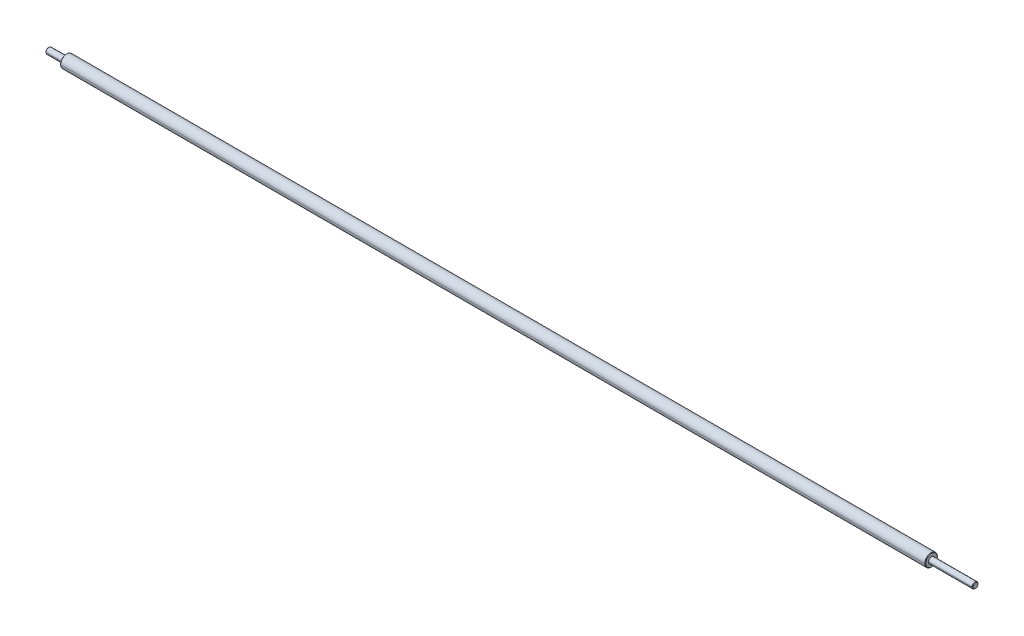
ISO-10303-21;
HEADER;
FILE_DESCRIPTION(('STEP AP214'),'2;1');
FILE_NAME('part.step','',(''),(''),'','','');
FILE_SCHEMA(('AUTOMOTIVE_DESIGN { 1 0 10303 214 1 1 1 1 }'));
ENDSEC;
DATA;
#1=APPLICATION_CONTEXT('core data for automotive mechanical design processes');
#2=APPLICATION_PROTOCOL_DEFINITION('international standard','automotive_design',2000,#1);
#3=PRODUCT_CONTEXT('',#1,'mechanical');
#4=PRODUCT('Part','Part','',(#3));
#5=PRODUCT_RELATED_PRODUCT_CATEGORY('part','',(#4));
#6=PRODUCT_DEFINITION_FORMATION('','',#4);
#7=PRODUCT_DEFINITION_CONTEXT('part definition',#1,'design');
#8=PRODUCT_DEFINITION('design','',#6,#7);
#9=PRODUCT_DEFINITION_SHAPE('','',#8);
#10=(LENGTH_UNIT() NAMED_UNIT(*) SI_UNIT(.MILLI.,.METRE.));
#11=(NAMED_UNIT(*) PLANE_ANGLE_UNIT() SI_UNIT($,.RADIAN.));
#12=(NAMED_UNIT(*) SI_UNIT($,.STERADIAN.) SOLID_ANGLE_UNIT());
#13=UNCERTAINTY_MEASURE_WITH_UNIT(LENGTH_MEASURE(1.E-05),#10,'distance_accuracy_value','');
#14=(GEOMETRIC_REPRESENTATION_CONTEXT(3) GLOBAL_UNCERTAINTY_ASSIGNED_CONTEXT((#13)) GLOBAL_UNIT_ASSIGNED_CONTEXT((#10,
#11,#12)) REPRESENTATION_CONTEXT('',''));
#15=CARTESIAN_POINT('',(0.,0.,0.));
#16=DIRECTION('',(0.,0.,1.));
#17=DIRECTION('',(1.,0.,0.));
#18=AXIS2_PLACEMENT_3D('',#15,#16,#17);
#19=CARTESIAN_POINT('',(-715.9625,0.,0.));
#20=DIRECTION('',(1.,0.,0.));
#21=DIRECTION('',(0.,0.,-1.));
#22=AXIS2_PLACEMENT_3D('',#19,#20,#21);
#23=CONICAL_SURFACE('',#22,3.96874999999986,0.785398163397446);
#24=DIRECTION('',(0.707106781186549,0.,0.707106781186546));
#25=VECTOR('',#24,1.);
#26=CARTESIAN_POINT('',(-715.9625,0.,3.96874999999986));
#27=LINE('',#26,#25);
#28=CARTESIAN_POINT('',(-715.9625,0.,3.96874999999986));
#29=VERTEX_POINT('',#28);
#30=CARTESIAN_POINT('',(-715.16875,0.,4.7625));
#31=VERTEX_POINT('',#30);
#32=EDGE_CURVE('E705',#29,#31,#27,.T.);
#33=ORIENTED_EDGE('',*,*,#32,.F.);
#34=CARTESIAN_POINT('',(-715.9625,0.,0.));
#35=DIRECTION('',(-1.,0.,0.));
#36=DIRECTION('',(0.,0.,-1.));
#37=AXIS2_PLACEMENT_3D('',#34,#35,#36);
#38=CIRCLE('',#37,3.96874999999986);
#39=CARTESIAN_POINT('',(-715.9625,0.,-3.96874999999986));
#40=VERTEX_POINT('',#39);
#41=EDGE_CURVE('E198',#40,#29,#38,.T.);
#42=ORIENTED_EDGE('',*,*,#41,.F.);
#43=DIRECTION('',(0.707106781186549,0.,-0.707106781186546));
#44=VECTOR('',#43,1.);
#45=CARTESIAN_POINT('',(-715.9625,0.,-3.96874999999986));
#46=LINE('',#45,#44);
#47=CARTESIAN_POINT('',(-715.16875,0.,-4.7625));
#48=VERTEX_POINT('',#47);
#49=EDGE_CURVE('E704',#40,#48,#46,.T.);
#50=ORIENTED_EDGE('',*,*,#49,.T.);
#51=CARTESIAN_POINT('',(-715.16875,0.,0.));
#52=DIRECTION('',(1.,0.,0.));
#53=DIRECTION('',(0.,0.,-1.));
#54=AXIS2_PLACEMENT_3D('',#51,#52,#53);
#55=CIRCLE('',#54,4.7625);
#56=EDGE_CURVE('E261',#31,#48,#55,.T.);
#57=ORIENTED_EDGE('',*,*,#56,.F.);
#58=EDGE_LOOP('',(#33,#42,#50,#57));
#59=FACE_BOUND('',#58,.T.);
#60=ADVANCED_FACE('F19',(#59),#23,.T.);
#61=CARTESIAN_POINT('',(756.46915,0.,0.));
#62=DIRECTION('',(-1.,0.,0.));
#63=DIRECTION('',(0.,0.,1.));
#64=AXIS2_PLACEMENT_3D('',#61,#62,#63);
#65=CONICAL_SURFACE('',#64,4.76250000000008,0.785398163397429);
#66=DIRECTION('',(-0.707106781186561,0.,-0.707106781186535));
#67=VECTOR('',#66,1.);
#68=CARTESIAN_POINT('',(756.46915,0.,-4.76250000000008));
#69=LINE('',#68,#67);
#70=CARTESIAN_POINT('',(757.2629,0.,-3.96875000000007));
#71=VERTEX_POINT('',#70);
#72=CARTESIAN_POINT('',(756.46915,0.,-4.76250000000008));
#73=VERTEX_POINT('',#72);
#74=EDGE_CURVE('E684',#71,#73,#69,.T.);
#75=ORIENTED_EDGE('',*,*,#74,.F.);
#76=CARTESIAN_POINT('',(757.2629,0.,0.));
#77=DIRECTION('',(1.,0.,0.));
#78=DIRECTION('',(0.,0.,1.));
#79=AXIS2_PLACEMENT_3D('',#76,#77,#78);
#80=CIRCLE('',#79,3.96875000000007);
#81=CARTESIAN_POINT('',(757.2629,0.,3.96875000000007));
#82=VERTEX_POINT('',#81);
#83=EDGE_CURVE('E288',#82,#71,#80,.T.);
#84=ORIENTED_EDGE('',*,*,#83,.F.);
#85=DIRECTION('',(-0.707106781186561,0.,0.707106781186535));
#86=VECTOR('',#85,1.);
#87=CARTESIAN_POINT('',(756.46915,0.,4.76250000000008));
#88=LINE('',#87,#86);
#89=CARTESIAN_POINT('',(756.46915,0.,4.76250000000008));
#90=VERTEX_POINT('',#89);
#91=EDGE_CURVE('E683',#82,#90,#88,.T.);
#92=ORIENTED_EDGE('',*,*,#91,.T.);
#93=CARTESIAN_POINT('',(756.46915,0.,0.));
#94=DIRECTION('',(-1.,0.,0.));
#95=DIRECTION('',(0.,0.,1.));
#96=AXIS2_PLACEMENT_3D('',#93,#94,#95);
#97=CIRCLE('',#96,4.76250000000008);
#98=EDGE_CURVE('E273',#73,#90,#97,.T.);
#99=ORIENTED_EDGE('',*,*,#98,.F.);
#100=EDGE_LOOP('',(#75,#84,#92,#99));
#101=FACE_BOUND('',#100,.T.);
#102=ADVANCED_FACE('F824',(#101),#65,.T.);
#103=CARTESIAN_POINT('',(686.6255,0.,0.));
#104=DIRECTION('',(-1.,0.,0.));
#105=DIRECTION('',(0.,0.,1.));
#106=AXIS2_PLACEMENT_3D('',#103,#104,#105);
#107=CONICAL_SURFACE('',#106,10.,0.785398163397448);
#108=DIRECTION('',(-0.707106781186548,0.,-0.707106781186548));
#109=VECTOR('',#108,1.);
#110=CARTESIAN_POINT('',(686.6255,0.,-10.));
#111=LINE('',#110,#109);
#112=CARTESIAN_POINT('',(687.3875,0.,-9.23800000000016));
#113=VERTEX_POINT('',#112);
#114=CARTESIAN_POINT('',(686.6255,0.,-10.));
#115=VERTEX_POINT('',#114);
#116=EDGE_CURVE('E670',#113,#115,#111,.T.);
#117=ORIENTED_EDGE('',*,*,#116,.F.);
#118=CARTESIAN_POINT('',(687.3875,0.,0.));
#119=DIRECTION('',(1.,0.,0.));
#120=DIRECTION('',(0.,0.,1.));
#121=AXIS2_PLACEMENT_3D('',#118,#119,#120);
#122=CIRCLE('',#121,9.23800000000016);
#123=CARTESIAN_POINT('',(687.3875,0.,9.23800000000016));
#124=VERTEX_POINT('',#123);
#125=EDGE_CURVE('E231',#124,#113,#122,.T.);
#126=ORIENTED_EDGE('',*,*,#125,.F.);
#127=DIRECTION('',(-0.707106781186548,0.,0.707106781186548));
#128=VECTOR('',#127,1.);
#129=CARTESIAN_POINT('',(686.6255,0.,10.));
#130=LINE('',#129,#128);
#131=CARTESIAN_POINT('',(686.6255,0.,10.));
#132=VERTEX_POINT('',#131);
#133=EDGE_CURVE('E213',#124,#132,#130,.T.);
#134=ORIENTED_EDGE('',*,*,#133,.T.);
#135=CARTESIAN_POINT('',(686.6255,0.,0.));
#136=DIRECTION('',(-1.,0.,0.));
#137=DIRECTION('',(0.,0.,1.));
#138=AXIS2_PLACEMENT_3D('',#135,#136,#137);
#139=CIRCLE('',#138,10.);
#140=EDGE_CURVE('E197',#115,#132,#139,.T.);
#141=ORIENTED_EDGE('',*,*,#140,.F.);
#142=EDGE_LOOP('',(#117,#126,#134,#141));
#143=FACE_BOUND('',#142,.T.);
#144=ADVANCED_FACE('F829',(#143),#107,.T.);
#145=CARTESIAN_POINT('',(-687.3875,0.,0.));
#146=DIRECTION('',(1.,0.,0.));
#147=DIRECTION('',(0.,0.,-1.));
#148=AXIS2_PLACEMENT_3D('',#145,#146,#147);
#149=CONICAL_SURFACE('',#148,9.238,0.785398163397436);
#150=DIRECTION('',(0.707106781186557,0.,0.707106781186539));
#151=VECTOR('',#150,1.);
#152=CARTESIAN_POINT('',(-687.3875,0.,9.238));
#153=LINE('',#152,#151);
#154=CARTESIAN_POINT('',(-687.3875,0.,9.238));
#155=VERTEX_POINT('',#154);
#156=CARTESIAN_POINT('',(-686.6255,0.,10.));
#157=VERTEX_POINT('',#156);
#158=EDGE_CURVE('E201',#155,#157,#153,.T.);
#159=ORIENTED_EDGE('',*,*,#158,.F.);
#160=CARTESIAN_POINT('',(-687.3875,0.,0.));
#161=DIRECTION('',(-1.,0.,0.));
#162=DIRECTION('',(0.,0.,-1.));
#163=AXIS2_PLACEMENT_3D('',#160,#161,#162);
#164=CIRCLE('',#163,9.238);
#165=CARTESIAN_POINT('',(-687.3875,0.,-9.238));
#166=VERTEX_POINT('',#165);
#167=EDGE_CURVE('E188',#166,#155,#164,.T.);
#168=ORIENTED_EDGE('',*,*,#167,.F.);
#169=DIRECTION('',(0.707106781186557,0.,-0.707106781186539));
#170=VECTOR('',#169,1.);
#171=CARTESIAN_POINT('',(-687.3875,0.,-9.238));
#172=LINE('',#171,#170);
#173=CARTESIAN_POINT('',(-686.6255,0.,-10.));
#174=VERTEX_POINT('',#173);
#175=EDGE_CURVE('E211',#166,#174,#172,.T.);
#176=ORIENTED_EDGE('',*,*,#175,.T.);
#177=CARTESIAN_POINT('',(-686.6255,0.,0.));
#178=DIRECTION('',(1.,0.,0.));
#179=DIRECTION('',(0.,0.,-1.));
#180=AXIS2_PLACEMENT_3D('',#177,#178,#179);
#181=CIRCLE('',#180,10.);
#182=EDGE_CURVE('E203',#157,#174,#181,.T.);
#183=ORIENTED_EDGE('',*,*,#182,.F.);
#184=EDGE_LOOP('',(#159,#168,#176,#183));
#185=FACE_BOUND('',#184,.T.);
#186=ADVANCED_FACE('F202',(#185),#149,.T.);
#187=CARTESIAN_POINT('',(-708.0123,1.27,-9.4615));
#188=DIRECTION('',(0.,1.,0.));
#189=DIRECTION('',(1.,0.,0.));
#190=AXIS2_PLACEMENT_3D('',#187,#188,#189);
#191=PLANE('',#190);
#192=CARTESIAN_POINT('',(-708.0123,1.27,-9.4615));
#193=DIRECTION('',(0.,1.,0.));
#194=DIRECTION('',(0.,0.,1.));
#195=AXIS2_PLACEMENT_3D('',#192,#193,#194);
#196=CIRCLE('',#195,6.477);
#197=CARTESIAN_POINT('',(-712.280841660902,1.27,-4.59004425359931));
#198=VERTEX_POINT('',#197);
#199=CARTESIAN_POINT('',(-708.0123,1.27,-2.98449999999997));
#200=VERTEX_POINT('',#199);
#201=EDGE_CURVE('E11',#198,#200,#196,.T.);
#202=ORIENTED_EDGE('',*,*,#201,.F.);
#203=DIRECTION('',(-1.,0.,0.));
#204=VECTOR('',#203,1.);
#205=CARTESIAN_POINT('',(-134.183097384659,1.27,-4.59004425359931));
#206=LINE('',#205,#204);
#207=CARTESIAN_POINT('',(-703.743758339097,1.27,-4.59004425359931));
#208=VERTEX_POINT('',#207);
#209=EDGE_CURVE('E446',#208,#198,#206,.T.);
#210=ORIENTED_EDGE('',*,*,#209,.F.);
#211=CARTESIAN_POINT('',(-708.0123,1.27,-9.4615));
#212=DIRECTION('',(0.,1.,0.));
#213=DIRECTION('',(0.,0.,1.));
#214=AXIS2_PLACEMENT_3D('',#211,#212,#213);
#215=CIRCLE('',#214,6.477);
#216=EDGE_CURVE('E646',#200,#208,#215,.T.);
#217=ORIENTED_EDGE('',*,*,#216,.F.);
#218=EDGE_LOOP('',(#202,#210,#217));
#219=FACE_BOUND('',#218,.T.);
#220=ADVANCED_FACE('F757',(#219),#191,.F.);
#221=CARTESIAN_POINT('',(-708.0123,-1.27,-9.4615));
#222=DIRECTION('',(0.,1.,0.));
#223=DIRECTION('',(1.,0.,0.));
#224=AXIS2_PLACEMENT_3D('',#221,#222,#223);
#225=PLANE('',#224);
#226=DIRECTION('',(-1.,0.,0.));
#227=VECTOR('',#226,1.);
#228=CARTESIAN_POINT('',(-134.183097384659,-1.27,-4.59004425359931));
#229=LINE('',#228,#227);
#230=CARTESIAN_POINT('',(-703.743758339097,-1.27,-4.59004425359931));
#231=VERTEX_POINT('',#230);
#232=CARTESIAN_POINT('',(-712.280841660902,-1.27,-4.59004425359931));
#233=VERTEX_POINT('',#232);
#234=EDGE_CURVE('E277',#231,#233,#229,.T.);
#235=ORIENTED_EDGE('',*,*,#234,.T.);
#236=CARTESIAN_POINT('',(-708.0123,-1.27,-9.4615));
#237=DIRECTION('',(0.,1.,0.));
#238=DIRECTION('',(0.,0.,1.));
#239=AXIS2_PLACEMENT_3D('',#236,#237,#238);
#240=CIRCLE('',#239,6.477);
#241=CARTESIAN_POINT('',(-708.0123,-1.27,-2.98449999999997));
#242=VERTEX_POINT('',#241);
#243=EDGE_CURVE('E28',#233,#242,#240,.T.);
#244=ORIENTED_EDGE('',*,*,#243,.T.);
#245=CARTESIAN_POINT('',(-708.0123,-1.27,-9.4615));
#246=DIRECTION('',(0.,1.,0.));
#247=DIRECTION('',(0.,0.,1.));
#248=AXIS2_PLACEMENT_3D('',#245,#246,#247);
#249=CIRCLE('',#248,6.477);
#250=EDGE_CURVE('E228',#242,#231,#249,.T.);
#251=ORIENTED_EDGE('',*,*,#250,.T.);
#252=EDGE_LOOP('',(#235,#244,#251));
#253=FACE_BOUND('',#252,.T.);
#254=ADVANCED_FACE('F429',(#253),#225,.T.);
#255=CARTESIAN_POINT('',(-708.0123,-1.27,-9.4615));
#256=DIRECTION('',(0.,1.,0.));
#257=DIRECTION('',(0.,0.,1.));
#258=AXIS2_PLACEMENT_3D('',#255,#256,#257);
#259=CYLINDRICAL_SURFACE('',#258,6.477);
#260=DIRECTION('',(0.,1.,0.));
#261=VECTOR('',#260,1.);
#262=CARTESIAN_POINT('',(-708.0123,-1.27,-2.98449999999997));
#263=LINE('',#262,#261);
#264=EDGE_CURVE('E653',#242,#200,#263,.T.);
#265=ORIENTED_EDGE('',*,*,#264,.F.);
#266=ORIENTED_EDGE('',*,*,#243,.F.);
#267=CARTESIAN_POINT('',(-712.469981908796,1.10561930857462E-13,-4.7625));
#268=CARTESIAN_POINT('',(-712.469983556609,-0.0551279731046178,-4.76250225574894));
#269=CARTESIAN_POINT('',(-712.469004358139,-0.110257156642612,-4.76154287953419));
#270=CARTESIAN_POINT('',(-712.46506218641,-0.220005331930944,-4.75772977673279));
#271=CARTESIAN_POINT('',(-712.462112658127,-0.274625254492995,-4.75488889015999));
#272=CARTESIAN_POINT('',(-712.454230279684,-0.383292358825264,-4.74736186886571));
#273=CARTESIAN_POINT('',(-712.449308383728,-0.437341038995007,-4.74268592864686));
#274=CARTESIAN_POINT('',(-712.437484366482,-0.544805895168098,-4.73154292933471));
#275=CARTESIAN_POINT('',(-712.430590562019,-0.598223766492842,-4.72508339670433));
#276=CARTESIAN_POINT('',(-712.414825233529,-0.704371039098741,-4.71042781333826));
#277=CARTESIAN_POINT('',(-712.405959301035,-0.757101949275266,-4.70223667538381));
#278=CARTESIAN_POINT('',(-712.386252678893,-0.861823070089124,-4.68417407561171));
#279=CARTESIAN_POINT('',(-712.375414807093,-0.91381422495686,-4.67430501280713));
#280=CARTESIAN_POINT('',(-712.351766493269,-1.01700653001428,-4.65294303858663));
#281=CARTESIAN_POINT('',(-712.338956094901,-1.06820769765984,-4.64145016310828));
#282=CARTESIAN_POINT('',(-712.311367753282,-1.16977678407098,-4.6169001477349));
#283=CARTESIAN_POINT('',(-712.296587127352,-1.22014345954855,-4.60384087749568));
#284=CARTESIAN_POINT('',(-712.280841660903,-1.26999999999999,-4.59004425359931));
#285=B_SPLINE_CURVE_WITH_KNOTS('',3,(#267,#268,#269,#270,#271,#272,#273,#274,#275,#276,#277,
#278,#279,#280,#281,#282,#283,#284),.UNSPECIFIED.,.F.,.F.,(4,2,2,2,2,2,2,2,4),(0.,
0.165368530495286,0.329620005174512,0.492971624264264,0.655644192593804,0.817861288027564,
0.979848374502722,1.14183187650604,1.30403823363602),.UNSPECIFIED.);
#286=CARTESIAN_POINT('',(-712.469981908796,1.23499449585826E-13,-4.7625));
#287=VERTEX_POINT('',#286);
#288=EDGE_CURVE('E264',#287,#233,#285,.T.);
#289=ORIENTED_EDGE('',*,*,#288,.F.);
#290=CARTESIAN_POINT('',(-712.280841660903,1.27,-4.5900442535993));
#291=CARTESIAN_POINT('',(-712.296587127352,1.22014345954861,-4.60384087749567));
#292=CARTESIAN_POINT('',(-712.311367753282,1.16977678407111,-4.61690014773487));
#293=CARTESIAN_POINT('',(-712.338956094901,1.06820769766008,-4.64145016310823));
#294=CARTESIAN_POINT('',(-712.351766493269,1.01700653001456,-4.65294303858657));
#295=CARTESIAN_POINT('',(-712.375414807093,0.913814224957216,-4.67430501280706));
#296=CARTESIAN_POINT('',(-712.386252678893,0.861823070089512,-4.68417407561164));
#297=CARTESIAN_POINT('',(-712.405959301035,0.757101949275704,-4.70223667538374));
#298=CARTESIAN_POINT('',(-712.414825233529,0.704371039099196,-4.7104278133382));
#299=CARTESIAN_POINT('',(-712.430590562019,0.598223766493316,-4.72508339670427));
#300=CARTESIAN_POINT('',(-712.437484366482,0.544805895168574,-4.73154292933465));
#301=CARTESIAN_POINT('',(-712.449308383728,0.43734103899547,-4.74268592864682));
#302=CARTESIAN_POINT('',(-712.454230279684,0.383292358825713,-4.74736186886567));
#303=CARTESIAN_POINT('',(-712.462112658127,0.274625254493403,-4.75488889015997));
#304=CARTESIAN_POINT('',(-712.46506218641,0.220005331931324,-4.75772977673277));
#305=CARTESIAN_POINT('',(-712.469004358139,0.110257156642921,-4.76154287953418));
#306=CARTESIAN_POINT('',(-712.469983556609,0.0551279731048826,-4.76250225574894));
#307=CARTESIAN_POINT('',(-712.469981908796,1.10561930857462E-13,-4.7625));
#308=B_SPLINE_CURVE_WITH_KNOTS('',3,(#290,#291,#292,#293,#294,#295,#296,#297,#298,#299,#300,
#301,#302,#303,#304,#305,#306,#307),.UNSPECIFIED.,.F.,.F.,(4,2,2,2,2,2,2,2,4),(0.,
0.162206357129804,0.324189859132988,0.486176945608053,0.648394041041763,0.8110666093713,
0.974418228461095,1.1386697031404,1.30403823363582),.UNSPECIFIED.);
#309=EDGE_CURVE('E450',#198,#287,#308,.T.);
#310=ORIENTED_EDGE('',*,*,#309,.F.);
#311=ORIENTED_EDGE('',*,*,#201,.T.);
#312=EDGE_LOOP('',(#265,#266,#289,#310,#311));
#313=FACE_BOUND('',#312,.T.);
#314=ADVANCED_FACE('F418',(#313),#259,.F.);
#315=CARTESIAN_POINT('',(743.7755,1.27,-9.4615));
#316=DIRECTION('',(0.,1.,0.));
#317=DIRECTION('',(1.,0.,0.));
#318=AXIS2_PLACEMENT_3D('',#315,#316,#317);
#319=PLANE('',#318);
#320=CARTESIAN_POINT('',(743.7755,1.27,-9.4615));
#321=DIRECTION('',(0.,1.,0.));
#322=DIRECTION('',(0.,0.,1.));
#323=AXIS2_PLACEMENT_3D('',#320,#321,#322);
#324=CIRCLE('',#323,6.477);
#325=CARTESIAN_POINT('',(739.506958339097,1.27,-4.59004425359939));
#326=VERTEX_POINT('',#325);
#327=CARTESIAN_POINT('',(743.7755,1.27,-2.98450000000005));
#328=VERTEX_POINT('',#327);
#329=EDGE_CURVE('E504',#326,#328,#324,.T.);
#330=ORIENTED_EDGE('',*,*,#329,.F.);
#331=DIRECTION('',(-1.,0.,0.));
#332=VECTOR('',#331,1.);
#333=CARTESIAN_POINT('',(-134.183097384659,1.27,-4.59004425359939));
#334=LINE('',#333,#332);
#335=CARTESIAN_POINT('',(748.044041660902,1.27,-4.59004425359939));
#336=VERTEX_POINT('',#335);
#337=EDGE_CURVE('E486',#336,#326,#334,.T.);
#338=ORIENTED_EDGE('',*,*,#337,.F.);
#339=CARTESIAN_POINT('',(743.7755,1.27,-9.4615));
#340=DIRECTION('',(0.,1.,0.));
#341=DIRECTION('',(0.,0.,1.));
#342=AXIS2_PLACEMENT_3D('',#339,#340,#341);
#343=CIRCLE('',#342,6.477);
#344=EDGE_CURVE('E236',#328,#336,#343,.T.);
#345=ORIENTED_EDGE('',*,*,#344,.F.);
#346=EDGE_LOOP('',(#330,#338,#345));
#347=FACE_BOUND('',#346,.T.);
#348=ADVANCED_FACE('F428',(#347),#319,.F.);
#349=CARTESIAN_POINT('',(743.7755,-1.27,-9.4615));
#350=DIRECTION('',(0.,1.,0.));
#351=DIRECTION('',(1.,0.,0.));
#352=AXIS2_PLACEMENT_3D('',#349,#350,#351);
#353=PLANE('',#352);
#354=DIRECTION('',(-1.,0.,0.));
#355=VECTOR('',#354,1.);
#356=CARTESIAN_POINT('',(-134.183097384659,-1.27,-4.59004425359939));
#357=LINE('',#356,#355);
#358=CARTESIAN_POINT('',(748.044041660902,-1.27,-4.59004425359939));
#359=VERTEX_POINT('',#358);
#360=CARTESIAN_POINT('',(739.506958339097,-1.27,-4.59004425359939));
#361=VERTEX_POINT('',#360);
#362=EDGE_CURVE('E282',#359,#361,#357,.T.);
#363=ORIENTED_EDGE('',*,*,#362,.T.);
#364=CARTESIAN_POINT('',(743.7755,-1.27,-9.4615));
#365=DIRECTION('',(0.,1.,0.));
#366=DIRECTION('',(0.,0.,1.));
#367=AXIS2_PLACEMENT_3D('',#364,#365,#366);
#368=CIRCLE('',#367,6.477);
#369=CARTESIAN_POINT('',(743.7755,-1.27,-2.98450000000005));
#370=VERTEX_POINT('',#369);
#371=EDGE_CURVE('E42',#361,#370,#368,.T.);
#372=ORIENTED_EDGE('',*,*,#371,.T.);
#373=CARTESIAN_POINT('',(743.7755,-1.27,-9.4615));
#374=DIRECTION('',(0.,1.,0.));
#375=DIRECTION('',(0.,0.,1.));
#376=AXIS2_PLACEMENT_3D('',#373,#374,#375);
#377=CIRCLE('',#376,6.477);
#378=EDGE_CURVE('E237',#370,#359,#377,.T.);
#379=ORIENTED_EDGE('',*,*,#378,.T.);
#380=EDGE_LOOP('',(#363,#372,#379));
#381=FACE_BOUND('',#380,.T.);
#382=ADVANCED_FACE('F517',(#381),#353,.T.);
#383=CARTESIAN_POINT('',(743.7755,-1.27,-9.4615));
#384=DIRECTION('',(0.,1.,0.));
#385=DIRECTION('',(0.,0.,1.));
#386=AXIS2_PLACEMENT_3D('',#383,#384,#385);
#387=CYLINDRICAL_SURFACE('',#386,6.477);
#388=DIRECTION('',(0.,1.,0.));
#389=VECTOR('',#388,1.);
#390=CARTESIAN_POINT('',(743.7755,-1.27,-2.98450000000005));
#391=LINE('',#390,#389);
#392=EDGE_CURVE('E232',#370,#328,#391,.T.);
#393=ORIENTED_EDGE('',*,*,#392,.F.);
#394=ORIENTED_EDGE('',*,*,#371,.F.);
#395=CARTESIAN_POINT('',(739.317818091204,1.10561930857464E-13,-4.76250000000008));
#396=CARTESIAN_POINT('',(739.317816443391,-0.0551279731045674,-4.76250225574902));
#397=CARTESIAN_POINT('',(739.318795641861,-0.110257156642511,-4.76154287953427));
#398=CARTESIAN_POINT('',(739.322737813589,-0.220005331930755,-4.75772977673288));
#399=CARTESIAN_POINT('',(739.325687341873,-0.274625254492768,-4.75488889016008));
#400=CARTESIAN_POINT('',(739.333569720316,-0.383292358824978,-4.74736186886581));
#401=CARTESIAN_POINT('',(739.338491616272,-0.4373410389947,-4.74268592864697));
#402=CARTESIAN_POINT('',(739.350315633518,-0.544805895167763,-4.73154292933483));
#403=CARTESIAN_POINT('',(739.357209437981,-0.5982237664925,-4.72508339670446));
#404=CARTESIAN_POINT('',(739.372974766471,-0.7043710390984,-4.71042781333839));
#405=CARTESIAN_POINT('',(739.381840698965,-0.757101949274932,-4.70223667538394));
#406=CARTESIAN_POINT('',(739.401547321107,-0.861823070088819,-4.68417407561185));
#407=CARTESIAN_POINT('',(739.412385192907,-0.913814224956577,-4.67430501280726));
#408=CARTESIAN_POINT('',(739.436033506731,-1.01700653001406,-4.65294303858676));
#409=CARTESIAN_POINT('',(739.448843905099,-1.06820769765965,-4.64145016310841));
#410=CARTESIAN_POINT('',(739.476432246718,-1.16977678407088,-4.61690014773501));
#411=CARTESIAN_POINT('',(739.491212872648,-1.22014345954849,-4.60384087749578));
#412=CARTESIAN_POINT('',(739.506958339097,-1.26999999999999,-4.59004425359939));
#413=B_SPLINE_CURVE_WITH_KNOTS('',3,(#395,#396,#397,#398,#399,#400,#401,#402,#403,#404,#405,
#406,#407,#408,#409,#410,#411,#412),.UNSPECIFIED.,.F.,.F.,(4,2,2,2,2,2,2,2,4),(0.,
0.165368530495135,0.329620005174247,0.492971624263935,0.655644192593454,0.817861288027233,
0.979848374502454,1.14183187650588,1.30403823363601),.UNSPECIFIED.);
#414=CARTESIAN_POINT('',(739.317818091204,1.23499449585826E-13,-4.76250000000009));
#415=VERTEX_POINT('',#414);
#416=EDGE_CURVE('E280',#415,#361,#413,.T.);
#417=ORIENTED_EDGE('',*,*,#416,.F.);
#418=CARTESIAN_POINT('',(739.506958339097,1.27,-4.59004425359939));
#419=CARTESIAN_POINT('',(739.491212872648,1.22014345954863,-4.60384087749574));
#420=CARTESIAN_POINT('',(739.476432246718,1.16977678407115,-4.61690014773494));
#421=CARTESIAN_POINT('',(739.448843905099,1.06820769766016,-4.64145016310829));
#422=CARTESIAN_POINT('',(739.436033506731,1.01700653001467,-4.65294303858663));
#423=CARTESIAN_POINT('',(739.412385192907,0.913814224957354,-4.67430501280711));
#424=CARTESIAN_POINT('',(739.401547321107,0.861823070089661,-4.68417407561169));
#425=CARTESIAN_POINT('',(739.381840698965,0.757101949275868,-4.70223667538379));
#426=CARTESIAN_POINT('',(739.372974766471,0.704371039099364,-4.71042781333825));
#427=CARTESIAN_POINT('',(739.357209437981,0.598223766493485,-4.72508339670433));
#428=CARTESIAN_POINT('',(739.350315633518,0.544805895168739,-4.73154292933471));
#429=CARTESIAN_POINT('',(739.338491616272,0.437341038995622,-4.74268592864689));
#430=CARTESIAN_POINT('',(739.333569720316,0.383292358825854,-4.74736186886574));
#431=CARTESIAN_POINT('',(739.325687341873,0.274625254493514,-4.75488889016004));
#432=CARTESIAN_POINT('',(739.322737813589,0.220005331931416,-4.75772977673285));
#433=CARTESIAN_POINT('',(739.318795641861,0.110257156642969,-4.76154287953426));
#434=CARTESIAN_POINT('',(739.317816443391,0.0551279731049067,-4.76250225574902));
#435=CARTESIAN_POINT('',(739.317818091204,1.10561930857464E-13,-4.76250000000008));
#436=B_SPLINE_CURVE_WITH_KNOTS('',3,(#418,#419,#420,#421,#422,#423,#424,#425,#426,#427,#428,
#429,#430,#431,#432,#433,#434,#435),.UNSPECIFIED.,.F.,.F.,(4,2,2,2,2,2,2,2,4),(0.,
0.162206357129733,0.324189859132862,0.486176945607894,0.648394041041592,0.811066609371141,
0.974418228460968,1.13866970314034,1.30403823363583),.UNSPECIFIED.);
#437=EDGE_CURVE('E459',#326,#415,#436,.T.);
#438=ORIENTED_EDGE('',*,*,#437,.F.);
#439=ORIENTED_EDGE('',*,*,#329,.T.);
#440=EDGE_LOOP('',(#393,#394,#417,#438,#439));
#441=FACE_BOUND('',#440,.T.);
#442=ADVANCED_FACE('F508',(#441),#387,.F.);
#443=CARTESIAN_POINT('',(757.2629,4.7625,0.));
#444=DIRECTION('',(-1.,0.,0.));
#445=DIRECTION('',(0.,0.,1.));
#446=AXIS2_PLACEMENT_3D('',#443,#444,#445);
#447=PLANE('',#446);
#448=ORIENTED_EDGE('',*,*,#83,.T.);
#449=CARTESIAN_POINT('',(757.2629,0.,0.));
#450=DIRECTION('',(1.,0.,0.));
#451=DIRECTION('',(0.,0.,1.));
#452=AXIS2_PLACEMENT_3D('',#449,#450,#451);
#453=CIRCLE('',#452,3.96875000000007);
#454=EDGE_CURVE('E696',#71,#82,#453,.T.);
#455=ORIENTED_EDGE('',*,*,#454,.T.);
#456=EDGE_LOOP('',(#448,#455));
#457=FACE_BOUND('',#456,.T.);
#458=ADVANCED_FACE('F393',(#457),#447,.F.);
#459=CARTESIAN_POINT('',(687.3875,10.0000000000002,0.));
#460=DIRECTION('',(-1.,0.,0.));
#461=DIRECTION('',(0.,0.,1.));
#462=AXIS2_PLACEMENT_3D('',#459,#460,#461);
#463=PLANE('',#462);
#464=CARTESIAN_POINT('',(687.3875,0.,0.));
#465=DIRECTION('',(-1.,0.,0.));
#466=DIRECTION('',(0.,0.,1.));
#467=AXIS2_PLACEMENT_3D('',#464,#465,#466);
#468=CIRCLE('',#467,4.76250000000017);
#469=CARTESIAN_POINT('',(687.3875,0.,4.76250000000017));
#470=VERTEX_POINT('',#469);
#471=CARTESIAN_POINT('',(687.3875,0.,-4.76250000000017));
#472=VERTEX_POINT('',#471);
#473=EDGE_CURVE('E247',#470,#472,#468,.T.);
#474=ORIENTED_EDGE('',*,*,#473,.T.);
#475=CARTESIAN_POINT('',(687.3875,0.,0.));
#476=DIRECTION('',(-1.,0.,0.));
#477=DIRECTION('',(0.,0.,1.));
#478=AXIS2_PLACEMENT_3D('',#475,#476,#477);
#479=CIRCLE('',#478,4.76250000000017);
#480=EDGE_CURVE('E276',#472,#470,#479,.T.);
#481=ORIENTED_EDGE('',*,*,#480,.T.);
#482=EDGE_LOOP('',(#474,#481));
#483=FACE_BOUND('',#482,.T.);
#484=ORIENTED_EDGE('',*,*,#125,.T.);
#485=CARTESIAN_POINT('',(687.3875,0.,0.));
#486=DIRECTION('',(1.,0.,0.));
#487=DIRECTION('',(0.,0.,1.));
#488=AXIS2_PLACEMENT_3D('',#485,#486,#487);
#489=CIRCLE('',#488,9.23800000000016);
#490=EDGE_CURVE('E676',#113,#124,#489,.T.);
#491=ORIENTED_EDGE('',*,*,#490,.T.);
#492=EDGE_LOOP('',(#484,#491));
#493=FACE_BOUND('',#492,.T.);
#494=ADVANCED_FACE('F883',(#483,#493),#463,.F.);
#495=CARTESIAN_POINT('',(-134.183097384659,0.,0.));
#496=DIRECTION('',(-1.,0.,0.));
#497=DIRECTION('',(0.,0.,1.));
#498=AXIS2_PLACEMENT_3D('',#495,#496,#497);
#499=CYLINDRICAL_SURFACE('',#498,10.);
#500=DIRECTION('',(-1.,0.,0.));
#501=VECTOR('',#500,1.);
#502=CARTESIAN_POINT('',(-134.183097384659,0.,-10.));
#503=LINE('',#502,#501);
#504=EDGE_CURVE('E238',#115,#174,#503,.T.);
#505=ORIENTED_EDGE('',*,*,#504,.F.);
#506=ORIENTED_EDGE('',*,*,#140,.T.);
#507=DIRECTION('',(-1.,0.,0.));
#508=VECTOR('',#507,1.);
#509=CARTESIAN_POINT('',(-134.183097384659,0.,10.));
#510=LINE('',#509,#508);
#511=EDGE_CURVE('E242',#132,#157,#510,.T.);
#512=ORIENTED_EDGE('',*,*,#511,.T.);
#513=ORIENTED_EDGE('',*,*,#182,.T.);
#514=EDGE_LOOP('',(#505,#506,#512,#513));
#515=FACE_BOUND('',#514,.T.);
#516=ADVANCED_FACE('F395',(#515),#499,.T.);
#517=CARTESIAN_POINT('',(-687.3875,4.7625,0.));
#518=DIRECTION('',(1.,0.,0.));
#519=DIRECTION('',(0.,1.,0.));
#520=AXIS2_PLACEMENT_3D('',#517,#518,#519);
#521=PLANE('',#520);
#522=CARTESIAN_POINT('',(-687.3875,0.,0.));
#523=DIRECTION('',(-1.,0.,0.));
#524=DIRECTION('',(0.,0.,1.));
#525=AXIS2_PLACEMENT_3D('',#522,#523,#524);
#526=CIRCLE('',#525,4.7625);
#527=CARTESIAN_POINT('',(-687.3875,0.,4.7625));
#528=VERTEX_POINT('',#527);
#529=CARTESIAN_POINT('',(-687.3875,0.,-4.7625));
#530=VERTEX_POINT('',#529);
#531=EDGE_CURVE('E256',#528,#530,#526,.T.);
#532=ORIENTED_EDGE('',*,*,#531,.F.);
#533=CARTESIAN_POINT('',(-687.3875,0.,0.));
#534=DIRECTION('',(-1.,0.,0.));
#535=DIRECTION('',(0.,0.,1.));
#536=AXIS2_PLACEMENT_3D('',#533,#534,#535);
#537=CIRCLE('',#536,4.7625);
#538=EDGE_CURVE('E265',#530,#528,#537,.T.);
#539=ORIENTED_EDGE('',*,*,#538,.F.);
#540=EDGE_LOOP('',(#532,#539));
#541=FACE_BOUND('',#540,.T.);
#542=ORIENTED_EDGE('',*,*,#167,.T.);
#543=CARTESIAN_POINT('',(-687.3875,0.,0.));
#544=DIRECTION('',(-1.,0.,0.));
#545=DIRECTION('',(0.,0.,-1.));
#546=AXIS2_PLACEMENT_3D('',#543,#544,#545);
#547=CIRCLE('',#546,9.238);
#548=EDGE_CURVE('E192',#155,#166,#547,.T.);
#549=ORIENTED_EDGE('',*,*,#548,.T.);
#550=EDGE_LOOP('',(#542,#549));
#551=FACE_BOUND('',#550,.T.);
#552=ADVANCED_FACE('F190',(#541,#551),#521,.F.);
#553=CARTESIAN_POINT('',(-715.9625,0.,0.));
#554=DIRECTION('',(1.,0.,0.));
#555=DIRECTION('',(0.,1.,0.));
#556=AXIS2_PLACEMENT_3D('',#553,#554,#555);
#557=PLANE('',#556);
#558=ORIENTED_EDGE('',*,*,#41,.T.);
#559=CARTESIAN_POINT('',(-715.9625,0.,0.));
#560=DIRECTION('',(-1.,0.,0.));
#561=DIRECTION('',(0.,0.,-1.));
#562=AXIS2_PLACEMENT_3D('',#559,#560,#561);
#563=CIRCLE('',#562,3.96874999999986);
#564=EDGE_CURVE('E718',#29,#40,#563,.T.);
#565=ORIENTED_EDGE('',*,*,#564,.T.);
#566=EDGE_LOOP('',(#558,#565));
#567=FACE_BOUND('',#566,.T.);
#568=ADVANCED_FACE('F311',(#567),#557,.F.);
#569=CARTESIAN_POINT('',(-134.183097384659,0.,0.));
#570=DIRECTION('',(-1.,0.,0.));
#571=DIRECTION('',(0.,0.,1.));
#572=AXIS2_PLACEMENT_3D('',#569,#570,#571);
#573=CYLINDRICAL_SURFACE('',#572,4.76250000000008);
#574=DIRECTION('',(-1.,0.,0.));
#575=VECTOR('',#574,1.);
#576=CARTESIAN_POINT('',(-134.183097384659,0.,-4.76250000000008));
#577=LINE('',#576,#575);
#578=CARTESIAN_POINT('',(748.233181908796,-1.22332973548074E-13,-4.76250000000009));
#579=VERTEX_POINT('',#578);
#580=EDGE_CURVE('E246',#73,#579,#577,.T.);
#581=ORIENTED_EDGE('',*,*,#580,.F.);
#582=ORIENTED_EDGE('',*,*,#98,.T.);
#583=DIRECTION('',(-1.,0.,0.));
#584=VECTOR('',#583,1.);
#585=CARTESIAN_POINT('',(-134.183097384659,0.,4.76250000000008));
#586=LINE('',#585,#584);
#587=EDGE_CURVE('E251',#90,#470,#586,.T.);
#588=ORIENTED_EDGE('',*,*,#587,.T.);
#589=ORIENTED_EDGE('',*,*,#480,.F.);
#590=DIRECTION('',(-1.,0.,0.));
#591=VECTOR('',#590,1.);
#592=CARTESIAN_POINT('',(-134.183097384659,0.,-4.76250000000008));
#593=LINE('',#592,#591);
#594=EDGE_CURVE('E252',#415,#472,#593,.T.);
#595=ORIENTED_EDGE('',*,*,#594,.F.);
#596=ORIENTED_EDGE('',*,*,#416,.T.);
#597=ORIENTED_EDGE('',*,*,#362,.F.);
#598=CARTESIAN_POINT('',(748.044041660902,-1.26999999999999,-4.59004425359939));
#599=CARTESIAN_POINT('',(748.059787127352,-1.22014345954854,-4.60384087749577));
#600=CARTESIAN_POINT('',(748.074567753281,-1.16977678407092,-4.616900147735));
#601=CARTESIAN_POINT('',(748.1021560949,-1.06820769765969,-4.6414501631084));
#602=CARTESIAN_POINT('',(748.114966493269,-1.0170065300141,-4.65294303858675));
#603=CARTESIAN_POINT('',(748.138614807092,-0.913814224956627,-4.67430501280725));
#604=CARTESIAN_POINT('',(748.149452678892,-0.861823070088884,-4.68417407561183));
#605=CARTESIAN_POINT('',(748.169159301035,-0.757101949275024,-4.70223667538393));
#606=CARTESIAN_POINT('',(748.178025233529,-0.704371039098504,-4.71042781333838));
#607=CARTESIAN_POINT('',(748.193790562019,-0.598223766492619,-4.72508339670444));
#608=CARTESIAN_POINT('',(748.200684366482,-0.544805895167886,-4.73154292933481));
#609=CARTESIAN_POINT('',(748.212508383728,-0.437341038994845,-4.74268592864696));
#610=CARTESIAN_POINT('',(748.217430279684,-0.383292358825141,-4.7473618688658));
#611=CARTESIAN_POINT('',(748.225312658128,-0.274625254492956,-4.75488889016007));
#612=CARTESIAN_POINT('',(748.22826218641,-0.220005331930948,-4.75772977673287));
#613=CARTESIAN_POINT('',(748.232204358139,-0.110257156642718,-4.76154287953426));
#614=CARTESIAN_POINT('',(748.233183556609,-0.0551279731047815,-4.76250225574902));
#615=CARTESIAN_POINT('',(748.233181908796,-1.28430228538475E-13,-4.76250000000008));
#616=B_SPLINE_CURVE_WITH_KNOTS('',3,(#598,#599,#600,#601,#602,#603,#604,#605,#606,#607,#608,
#609,#610,#611,#612,#613,#614,#615),.UNSPECIFIED.,.F.,.F.,(4,2,2,2,2,2,2,2,4),(0.,
0.162206357130229,0.324189859133627,0.486176945608868,0.648394041042656,0.811066609372144,
0.974418228461818,1.13866970314089,1.30403823363599),.UNSPECIFIED.);
#617=EDGE_CURVE('E243',#359,#579,#616,.T.);
#618=ORIENTED_EDGE('',*,*,#617,.T.);
#619=EDGE_LOOP('',(#581,#582,#588,#589,#595,#596,#597,#618));
#620=FACE_BOUND('',#619,.T.);
#621=ADVANCED_FACE('F300',(#620),#573,.T.);
#622=CARTESIAN_POINT('',(-134.183097384659,0.,0.));
#623=DIRECTION('',(-1.,0.,0.));
#624=DIRECTION('',(0.,0.,1.));
#625=AXIS2_PLACEMENT_3D('',#622,#623,#624);
#626=CYLINDRICAL_SURFACE('',#625,4.7625);
#627=DIRECTION('',(-1.,0.,0.));
#628=VECTOR('',#627,1.);
#629=CARTESIAN_POINT('',(-134.183097384659,0.,-4.7625));
#630=LINE('',#629,#628);
#631=CARTESIAN_POINT('',(-703.554618091204,-1.22332973444676E-13,-4.7625));
#632=VERTEX_POINT('',#631);
#633=EDGE_CURVE('E260',#530,#632,#630,.T.);
#634=ORIENTED_EDGE('',*,*,#633,.F.);
#635=ORIENTED_EDGE('',*,*,#538,.T.);
#636=DIRECTION('',(-1.,0.,0.));
#637=VECTOR('',#636,1.);
#638=CARTESIAN_POINT('',(-134.183097384659,0.,4.7625));
#639=LINE('',#638,#637);
#640=EDGE_CURVE('E266',#528,#31,#639,.T.);
#641=ORIENTED_EDGE('',*,*,#640,.T.);
#642=ORIENTED_EDGE('',*,*,#56,.T.);
#643=DIRECTION('',(-1.,0.,0.));
#644=VECTOR('',#643,1.);
#645=CARTESIAN_POINT('',(-134.183097384659,0.,-4.7625));
#646=LINE('',#645,#644);
#647=EDGE_CURVE('E270',#287,#48,#646,.T.);
#648=ORIENTED_EDGE('',*,*,#647,.F.);
#649=ORIENTED_EDGE('',*,*,#288,.T.);
#650=ORIENTED_EDGE('',*,*,#234,.F.);
#651=CARTESIAN_POINT('',(-703.743758339098,-1.26999999999999,-4.59004425359931));
#652=CARTESIAN_POINT('',(-703.728012872649,-1.22014345954863,-4.60384087749566));
#653=CARTESIAN_POINT('',(-703.713232246719,-1.16977678407115,-4.61690014773486));
#654=CARTESIAN_POINT('',(-703.6856439051,-1.06820769766017,-4.64145016310821));
#655=CARTESIAN_POINT('',(-703.672833506731,-1.01700653001467,-4.65294303858654));
#656=CARTESIAN_POINT('',(-703.649185192908,-0.913814224957356,-4.67430501280703));
#657=CARTESIAN_POINT('',(-703.638347321108,-0.861823070089662,-4.68417407561161));
#658=CARTESIAN_POINT('',(-703.618640698965,-0.757101949275873,-4.70223667538371));
#659=CARTESIAN_POINT('',(-703.609774766471,-0.704371039099375,-4.71042781333817));
#660=CARTESIAN_POINT('',(-703.594009437981,-0.598223766493495,-4.72508339670425));
#661=CARTESIAN_POINT('',(-703.587115633518,-0.544805895168744,-4.73154292933463));
#662=CARTESIAN_POINT('',(-703.575291616272,-0.437341038995629,-4.74268592864681));
#663=CARTESIAN_POINT('',(-703.570369720316,-0.383292358825869,-4.74736186886566));
#664=CARTESIAN_POINT('',(-703.562487341872,-0.274625254493535,-4.75488889015996));
#665=CARTESIAN_POINT('',(-703.559537813589,-0.220005331931434,-4.75772977673277));
#666=CARTESIAN_POINT('',(-703.555595641861,-0.110257156642979,-4.76154287953418));
#667=CARTESIAN_POINT('',(-703.554616443391,-0.0551279731049123,-4.76250225574894));
#668=CARTESIAN_POINT('',(-703.554618091204,-1.28430228538472E-13,-4.7625));
#669=B_SPLINE_CURVE_WITH_KNOTS('',3,(#651,#652,#653,#654,#655,#656,#657,#658,#659,#660,#661,
#662,#663,#664,#665,#666,#667,#668),.UNSPECIFIED.,.F.,.F.,(4,2,2,2,2,2,2,2,4),(0.,
0.162206357129791,0.32418985913297,0.486176945608047,0.648394041041778,0.811066609371322,
0.974418228461167,1.13866970314052,1.30403823363601),.UNSPECIFIED.);
#670=EDGE_CURVE('E377',#231,#632,#669,.T.);
#671=ORIENTED_EDGE('',*,*,#670,.T.);
#672=EDGE_LOOP('',(#634,#635,#641,#642,#648,#649,#650,#671));
#673=FACE_BOUND('',#672,.T.);
#674=ADVANCED_FACE('F310',(#673),#626,.T.);
#675=CARTESIAN_POINT('',(-134.183097384659,0.,0.));
#676=DIRECTION('',(-1.,0.,0.));
#677=DIRECTION('',(0.,0.,1.));
#678=AXIS2_PLACEMENT_3D('',#675,#676,#677);
#679=CYLINDRICAL_SURFACE('',#678,4.7625);
#680=ORIENTED_EDGE('',*,*,#531,.T.);
#681=ORIENTED_EDGE('',*,*,#633,.T.);
#682=CARTESIAN_POINT('',(-703.554618091204,-1.28430228538472E-13,-4.7625));
#683=CARTESIAN_POINT('',(-703.554616443391,0.0551279731046159,-4.76250225574894));
#684=CARTESIAN_POINT('',(-703.555595641861,0.110257156642643,-4.76154287953419));
#685=CARTESIAN_POINT('',(-703.559537813589,0.220005331931033,-4.75772977673279));
#686=CARTESIAN_POINT('',(-703.562487341872,0.274625254493108,-4.75488889015998));
#687=CARTESIAN_POINT('',(-703.570369720316,0.383292358825406,-4.7473618688657));
#688=CARTESIAN_POINT('',(-703.575291616272,0.437341038995154,-4.74268592864685));
#689=CARTESIAN_POINT('',(-703.587115633518,0.544805895168263,-4.73154292933469));
#690=CARTESIAN_POINT('',(-703.594009437981,0.59822376649302,-4.72508339670431));
#691=CARTESIAN_POINT('',(-703.609774766471,0.704371039098924,-4.71042781333824));
#692=CARTESIAN_POINT('',(-703.618640698965,0.757101949275441,-4.70223667538378));
#693=CARTESIAN_POINT('',(-703.638347321108,0.86182307008928,-4.68417407561168));
#694=CARTESIAN_POINT('',(-703.649185192908,0.913814224957006,-4.6743050128071));
#695=CARTESIAN_POINT('',(-703.672833506731,1.0170065300144,-4.6529430385866));
#696=CARTESIAN_POINT('',(-703.6856439051,1.06820769765994,-4.64145016310826));
#697=CARTESIAN_POINT('',(-703.713232246719,1.16977678407104,-4.61690014773488));
#698=CARTESIAN_POINT('',(-703.728012872649,1.22014345954858,-4.60384087749568));
#699=CARTESIAN_POINT('',(-703.743758339098,1.27,-4.5900442535993));
#700=B_SPLINE_CURVE_WITH_KNOTS('',3,(#682,#683,#684,#685,#686,#687,#688,#689,#690,#691,#692,
#693,#694,#695,#696,#697,#698,#699),.UNSPECIFIED.,.F.,.F.,(4,2,2,2,2,2,2,2,4),(0.,
0.165368530495375,0.329620005174647,0.492971624264458,0.655644192594014,0.8178612880278,
0.97984837450297,1.14183187650629,1.30403823363626),.UNSPECIFIED.);
#701=EDGE_CURVE('E642',#632,#208,#700,.T.);
#702=ORIENTED_EDGE('',*,*,#701,.T.);
#703=ORIENTED_EDGE('',*,*,#209,.T.);
#704=ORIENTED_EDGE('',*,*,#309,.T.);
#705=ORIENTED_EDGE('',*,*,#647,.T.);
#706=CARTESIAN_POINT('',(-715.16875,0.,0.));
#707=DIRECTION('',(1.,0.,0.));
#708=DIRECTION('',(0.,0.,-1.));
#709=AXIS2_PLACEMENT_3D('',#706,#707,#708);
#710=CIRCLE('',#709,4.7625);
#711=EDGE_CURVE('E700',#48,#31,#710,.T.);
#712=ORIENTED_EDGE('',*,*,#711,.T.);
#713=ORIENTED_EDGE('',*,*,#640,.F.);
#714=EDGE_LOOP('',(#680,#681,#702,#703,#704,#705,#712,#713));
#715=FACE_BOUND('',#714,.T.);
#716=ADVANCED_FACE('F351',(#715),#679,.T.);
#717=CARTESIAN_POINT('',(-134.183097384659,0.,0.));
#718=DIRECTION('',(-1.,0.,0.));
#719=DIRECTION('',(0.,0.,1.));
#720=AXIS2_PLACEMENT_3D('',#717,#718,#719);
#721=CYLINDRICAL_SURFACE('',#720,4.76250000000008);
#722=CARTESIAN_POINT('',(756.46915,0.,0.));
#723=DIRECTION('',(-1.,0.,0.));
#724=DIRECTION('',(0.,0.,1.));
#725=AXIS2_PLACEMENT_3D('',#722,#723,#724);
#726=CIRCLE('',#725,4.76250000000008);
#727=EDGE_CURVE('E680',#90,#73,#726,.T.);
#728=ORIENTED_EDGE('',*,*,#727,.T.);
#729=ORIENTED_EDGE('',*,*,#580,.T.);
#730=CARTESIAN_POINT('',(748.233181908796,-1.28430228538475E-13,-4.76250000000008));
#731=CARTESIAN_POINT('',(748.233183556609,0.0551279731044852,-4.76250225574902));
#732=CARTESIAN_POINT('',(748.232204358139,0.110257156642382,-4.76154287953427));
#733=CARTESIAN_POINT('',(748.22826218641,0.220005331930546,-4.75772977673289));
#734=CARTESIAN_POINT('',(748.225312658128,0.274625254492528,-4.7548888901601));
#735=CARTESIAN_POINT('',(748.217430279684,0.383292358824677,-4.74736186886584));
#736=CARTESIAN_POINT('',(748.212508383728,0.43734103899437,-4.742685928647));
#737=CARTESIAN_POINT('',(748.200684366482,0.544805895167406,-4.73154292933487));
#738=CARTESIAN_POINT('',(748.193790562019,0.598223766492144,-4.7250833967045));
#739=CARTESIAN_POINT('',(748.178025233529,0.704371039098052,-4.71042781333845));
#740=CARTESIAN_POINT('',(748.169159301035,0.757101949274592,-4.702236675384));
#741=CARTESIAN_POINT('',(748.149452678892,0.861823070088503,-4.6841740756119));
#742=CARTESIAN_POINT('',(748.138614807092,0.913814224956279,-4.67430501280732));
#743=CARTESIAN_POINT('',(748.114966493269,1.01700653001383,-4.65294303858681));
#744=CARTESIAN_POINT('',(748.1021560949,1.06820769765947,-4.64145016310845));
#745=CARTESIAN_POINT('',(748.074567753281,1.16977678407081,-4.61690014773503));
#746=CARTESIAN_POINT('',(748.059787127352,1.22014345954849,-4.60384087749579));
#747=CARTESIAN_POINT('',(748.044041660902,1.27,-4.59004425359939));
#748=B_SPLINE_CURVE_WITH_KNOTS('',3,(#730,#731,#732,#733,#734,#735,#736,#737,#738,#739,#740,
#741,#742,#743,#744,#745,#746,#747),.UNSPECIFIED.,.F.,.F.,(4,2,2,2,2,2,2,2,4),(0.,
0.165368530494982,0.329620005173972,0.492971624263615,0.655644192593116,0.817861288026958,
0.979848374502295,1.14183187650583,1.30403823363624),.UNSPECIFIED.);
#749=EDGE_CURVE('E369',#579,#336,#748,.T.);
#750=ORIENTED_EDGE('',*,*,#749,.T.);
#751=ORIENTED_EDGE('',*,*,#337,.T.);
#752=ORIENTED_EDGE('',*,*,#437,.T.);
#753=ORIENTED_EDGE('',*,*,#594,.T.);
#754=ORIENTED_EDGE('',*,*,#473,.F.);
#755=ORIENTED_EDGE('',*,*,#587,.F.);
#756=EDGE_LOOP('',(#728,#729,#750,#751,#752,#753,#754,#755));
#757=FACE_BOUND('',#756,.T.);
#758=ADVANCED_FACE('F464',(#757),#721,.T.);
#759=CARTESIAN_POINT('',(-134.183097384659,0.,0.));
#760=DIRECTION('',(-1.,0.,0.));
#761=DIRECTION('',(0.,0.,1.));
#762=AXIS2_PLACEMENT_3D('',#759,#760,#761);
#763=CYLINDRICAL_SURFACE('',#762,10.);
#764=CARTESIAN_POINT('',(686.6255,0.,0.));
#765=DIRECTION('',(-1.,0.,0.));
#766=DIRECTION('',(0.,0.,1.));
#767=AXIS2_PLACEMENT_3D('',#764,#765,#766);
#768=CIRCLE('',#767,10.);
#769=EDGE_CURVE('E220',#132,#115,#768,.T.);
#770=ORIENTED_EDGE('',*,*,#769,.T.);
#771=ORIENTED_EDGE('',*,*,#504,.T.);
#772=CARTESIAN_POINT('',(-686.6255,0.,0.));
#773=DIRECTION('',(1.,0.,0.));
#774=DIRECTION('',(0.,0.,-1.));
#775=AXIS2_PLACEMENT_3D('',#772,#773,#774);
#776=CIRCLE('',#775,10.);
#777=EDGE_CURVE('E208',#174,#157,#776,.T.);
#778=ORIENTED_EDGE('',*,*,#777,.T.);
#779=ORIENTED_EDGE('',*,*,#511,.F.);
#780=EDGE_LOOP('',(#770,#771,#778,#779));
#781=FACE_BOUND('',#780,.T.);
#782=ADVANCED_FACE('F350',(#781),#763,.T.);
#783=CARTESIAN_POINT('',(743.7755,-1.27,-9.4615));
#784=DIRECTION('',(0.,1.,0.));
#785=DIRECTION('',(0.,0.,1.));
#786=AXIS2_PLACEMENT_3D('',#783,#784,#785);
#787=CYLINDRICAL_SURFACE('',#786,6.477);
#788=ORIENTED_EDGE('',*,*,#378,.F.);
#789=ORIENTED_EDGE('',*,*,#392,.T.);
#790=ORIENTED_EDGE('',*,*,#344,.T.);
#791=ORIENTED_EDGE('',*,*,#749,.F.);
#792=ORIENTED_EDGE('',*,*,#617,.F.);
#793=EDGE_LOOP('',(#788,#789,#790,#791,#792));
#794=FACE_BOUND('',#793,.T.);
#795=ADVANCED_FACE('F341',(#794),#787,.F.);
#796=CARTESIAN_POINT('',(-708.0123,-1.27,-9.4615));
#797=DIRECTION('',(0.,1.,0.));
#798=DIRECTION('',(0.,0.,1.));
#799=AXIS2_PLACEMENT_3D('',#796,#797,#798);
#800=CYLINDRICAL_SURFACE('',#799,6.477);
#801=ORIENTED_EDGE('',*,*,#250,.F.);
#802=ORIENTED_EDGE('',*,*,#264,.T.);
#803=ORIENTED_EDGE('',*,*,#216,.T.);
#804=ORIENTED_EDGE('',*,*,#701,.F.);
#805=ORIENTED_EDGE('',*,*,#670,.F.);
#806=EDGE_LOOP('',(#801,#802,#803,#804,#805));
#807=FACE_BOUND('',#806,.T.);
#808=ADVANCED_FACE('F314',(#807),#800,.F.);
#809=CARTESIAN_POINT('',(-687.3875,0.,0.));
#810=DIRECTION('',(1.,0.,0.));
#811=DIRECTION('',(0.,0.,-1.));
#812=AXIS2_PLACEMENT_3D('',#809,#810,#811);
#813=CONICAL_SURFACE('',#812,9.238,0.785398163397436);
#814=ORIENTED_EDGE('',*,*,#548,.F.);
#815=ORIENTED_EDGE('',*,*,#158,.T.);
#816=ORIENTED_EDGE('',*,*,#777,.F.);
#817=ORIENTED_EDGE('',*,*,#175,.F.);
#818=EDGE_LOOP('',(#814,#815,#816,#817));
#819=FACE_BOUND('',#818,.T.);
#820=ADVANCED_FACE('F210',(#819),#813,.T.);
#821=CARTESIAN_POINT('',(686.6255,0.,0.));
#822=DIRECTION('',(-1.,0.,0.));
#823=DIRECTION('',(0.,0.,1.));
#824=AXIS2_PLACEMENT_3D('',#821,#822,#823);
#825=CONICAL_SURFACE('',#824,10.,0.785398163397448);
#826=ORIENTED_EDGE('',*,*,#490,.F.);
#827=ORIENTED_EDGE('',*,*,#116,.T.);
#828=ORIENTED_EDGE('',*,*,#769,.F.);
#829=ORIENTED_EDGE('',*,*,#133,.F.);
#830=EDGE_LOOP('',(#826,#827,#828,#829));
#831=FACE_BOUND('',#830,.T.);
#832=ADVANCED_FACE('F312',(#831),#825,.T.);
#833=CARTESIAN_POINT('',(756.46915,0.,0.));
#834=DIRECTION('',(-1.,0.,0.));
#835=DIRECTION('',(0.,0.,1.));
#836=AXIS2_PLACEMENT_3D('',#833,#834,#835);
#837=CONICAL_SURFACE('',#836,4.76250000000008,0.785398163397429);
#838=ORIENTED_EDGE('',*,*,#454,.F.);
#839=ORIENTED_EDGE('',*,*,#74,.T.);
#840=ORIENTED_EDGE('',*,*,#727,.F.);
#841=ORIENTED_EDGE('',*,*,#91,.F.);
#842=EDGE_LOOP('',(#838,#839,#840,#841));
#843=FACE_BOUND('',#842,.T.);
#844=ADVANCED_FACE('F518',(#843),#837,.T.);
#845=CARTESIAN_POINT('',(-715.9625,0.,0.));
#846=DIRECTION('',(1.,0.,0.));
#847=DIRECTION('',(0.,0.,-1.));
#848=AXIS2_PLACEMENT_3D('',#845,#846,#847);
#849=CONICAL_SURFACE('',#848,3.96874999999986,0.785398163397446);
#850=ORIENTED_EDGE('',*,*,#564,.F.);
#851=ORIENTED_EDGE('',*,*,#32,.T.);
#852=ORIENTED_EDGE('',*,*,#711,.F.);
#853=ORIENTED_EDGE('',*,*,#49,.F.);
#854=EDGE_LOOP('',(#850,#851,#852,#853));
#855=FACE_BOUND('',#854,.T.);
#856=ADVANCED_FACE('F813',(#855),#849,.T.);
#857=CLOSED_SHELL('',(#60,#102,#144,#186,#220,#254,#314,#348,#382,#442,#458,#494,#516,#552,#568,
#621,#674,#716,#758,#782,#795,#808,#820,#832,#844,#856));
#858=MANIFOLD_SOLID_BREP('B1',#857);
#859=ADVANCED_BREP_SHAPE_REPRESENTATION('',(#18,#858),#14);
#860=SHAPE_DEFINITION_REPRESENTATION(#9,#859);
ENDSEC;
END-ISO-10303-21;
